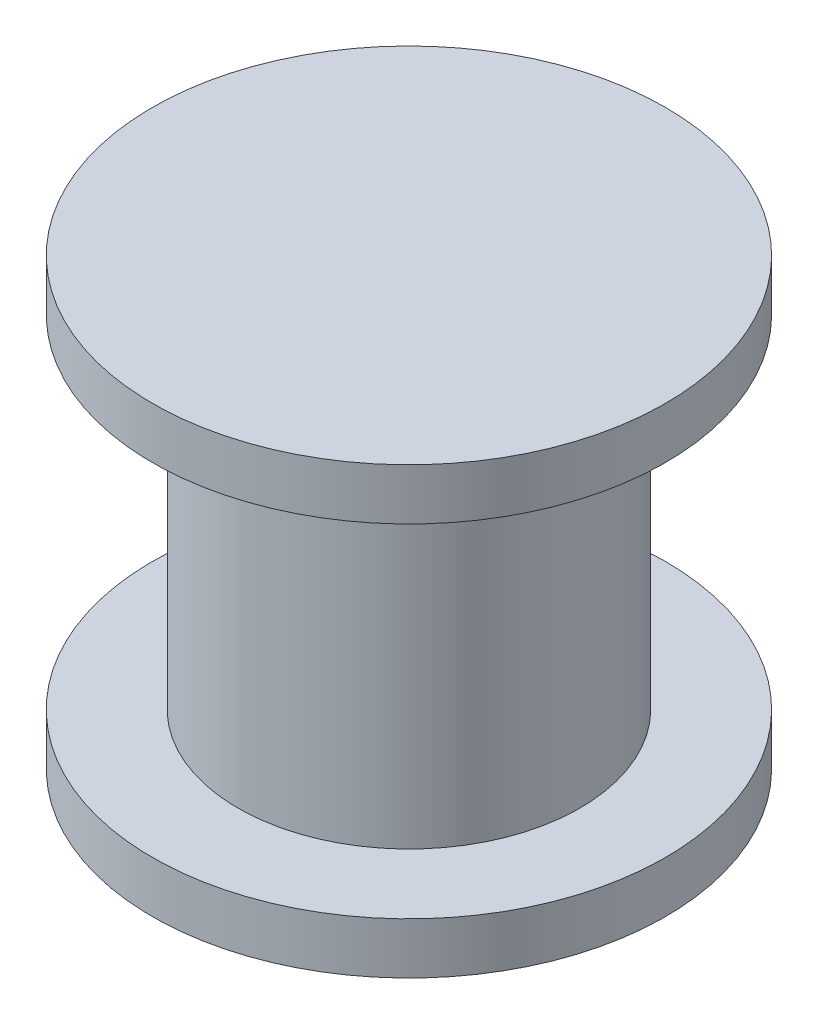
ISO-10303-21;
HEADER;
FILE_DESCRIPTION(('STEP AP214'),'2;1');
FILE_NAME('part.step','',(''),(''),'','','');
FILE_SCHEMA(('AUTOMOTIVE_DESIGN { 1 0 10303 214 1 1 1 1 }'));
ENDSEC;
DATA;
#1=APPLICATION_CONTEXT('core data for automotive mechanical design processes');
#2=APPLICATION_PROTOCOL_DEFINITION('international standard','automotive_design',2000,#1);
#3=PRODUCT_CONTEXT('',#1,'mechanical');
#4=PRODUCT('Part','Part','',(#3));
#5=PRODUCT_RELATED_PRODUCT_CATEGORY('part','',(#4));
#6=PRODUCT_DEFINITION_FORMATION('','',#4);
#7=PRODUCT_DEFINITION_CONTEXT('part definition',#1,'design');
#8=PRODUCT_DEFINITION('design','',#6,#7);
#9=PRODUCT_DEFINITION_SHAPE('','',#8);
#10=(LENGTH_UNIT() NAMED_UNIT(*) SI_UNIT(.MILLI.,.METRE.));
#11=(NAMED_UNIT(*) PLANE_ANGLE_UNIT() SI_UNIT($,.RADIAN.));
#12=(NAMED_UNIT(*) SI_UNIT($,.STERADIAN.) SOLID_ANGLE_UNIT());
#13=UNCERTAINTY_MEASURE_WITH_UNIT(LENGTH_MEASURE(1.E-05),#10,'distance_accuracy_value','');
#14=(GEOMETRIC_REPRESENTATION_CONTEXT(3) GLOBAL_UNCERTAINTY_ASSIGNED_CONTEXT((#13)) GLOBAL_UNIT_ASSIGNED_CONTEXT((#10,
#11,#12)) REPRESENTATION_CONTEXT('',''));
#15=CARTESIAN_POINT('',(0.,0.,0.));
#16=DIRECTION('',(0.,0.,1.));
#17=DIRECTION('',(1.,0.,0.));
#18=AXIS2_PLACEMENT_3D('',#15,#16,#17);
#19=CARTESIAN_POINT('',(0.,0.,0.));
#20=DIRECTION('',(0.,-1.,0.));
#21=DIRECTION('',(0.,0.,-1.));
#22=AXIS2_PLACEMENT_3D('',#19,#20,#21);
#23=CYLINDRICAL_SURFACE('',#22,15.);
#24=CARTESIAN_POINT('',(0.,3.,0.));
#25=DIRECTION('',(0.,-1.,0.));
#26=DIRECTION('',(0.,0.,-1.));
#27=AXIS2_PLACEMENT_3D('',#24,#25,#26);
#28=CIRCLE('',#27,15.);
#29=CARTESIAN_POINT('',(0.,3.,-15.));
#30=VERTEX_POINT('',#29);
#31=EDGE_CURVE('E55',#30,#30,#28,.T.);
#32=ORIENTED_EDGE('',*,*,#31,.T.);
#33=EDGE_LOOP('',(#32));
#34=FACE_BOUND('',#33,.T.);
#35=CARTESIAN_POINT('',(0.,0.,0.));
#36=DIRECTION('',(0.,-1.,0.));
#37=DIRECTION('',(0.,0.,-1.));
#38=AXIS2_PLACEMENT_3D('',#35,#36,#37);
#39=CIRCLE('',#38,15.);
#40=CARTESIAN_POINT('',(0.,0.,-15.));
#41=VERTEX_POINT('',#40);
#42=EDGE_CURVE('E10',#41,#41,#39,.T.);
#43=ORIENTED_EDGE('',*,*,#42,.F.);
#44=EDGE_LOOP('',(#43));
#45=FACE_BOUND('',#44,.T.);
#46=ADVANCED_FACE('F33',(#34,#45),#23,.T.);
#47=CARTESIAN_POINT('',(0.,0.,0.));
#48=DIRECTION('',(0.,-1.,0.));
#49=DIRECTION('',(0.,0.,-1.));
#50=AXIS2_PLACEMENT_3D('',#47,#48,#49);
#51=PLANE('',#50);
#52=ORIENTED_EDGE('',*,*,#42,.T.);
#53=EDGE_LOOP('',(#52));
#54=FACE_BOUND('',#53,.T.);
#55=ADVANCED_FACE('F79',(#54),#51,.T.);
#56=CARTESIAN_POINT('',(0.,26.,0.));
#57=DIRECTION('',(0.,-1.,0.));
#58=DIRECTION('',(0.,0.,-1.));
#59=AXIS2_PLACEMENT_3D('',#56,#57,#58);
#60=PLANE('',#59);
#61=CARTESIAN_POINT('',(0.,26.,0.));
#62=DIRECTION('',(0.,-1.,0.));
#63=DIRECTION('',(0.,0.,-1.));
#64=AXIS2_PLACEMENT_3D('',#61,#62,#63);
#65=CIRCLE('',#64,15.);
#66=CARTESIAN_POINT('',(0.,26.,-15.));
#67=VERTEX_POINT('',#66);
#68=EDGE_CURVE('E39',#67,#67,#65,.T.);
#69=ORIENTED_EDGE('',*,*,#68,.F.);
#70=EDGE_LOOP('',(#69));
#71=FACE_BOUND('',#70,.T.);
#72=ADVANCED_FACE('F83',(#71),#60,.F.);
#73=CARTESIAN_POINT('',(0.,0.,0.));
#74=DIRECTION('',(0.,-1.,0.));
#75=DIRECTION('',(0.,0.,-1.));
#76=AXIS2_PLACEMENT_3D('',#73,#74,#75);
#77=CYLINDRICAL_SURFACE('',#76,15.);
#78=ORIENTED_EDGE('',*,*,#68,.T.);
#79=EDGE_LOOP('',(#78));
#80=FACE_BOUND('',#79,.T.);
#81=CARTESIAN_POINT('',(0.,23.,0.));
#82=DIRECTION('',(0.,-1.,0.));
#83=DIRECTION('',(0.,0.,-1.));
#84=AXIS2_PLACEMENT_3D('',#81,#82,#83);
#85=CIRCLE('',#84,15.);
#86=CARTESIAN_POINT('',(0.,23.,-15.));
#87=VERTEX_POINT('',#86);
#88=EDGE_CURVE('E43',#87,#87,#85,.T.);
#89=ORIENTED_EDGE('',*,*,#88,.F.);
#90=EDGE_LOOP('',(#89));
#91=FACE_BOUND('',#90,.T.);
#92=ADVANCED_FACE('F75',(#80,#91),#77,.T.);
#93=CARTESIAN_POINT('',(0.,23.,0.));
#94=DIRECTION('',(0.,-1.,0.));
#95=DIRECTION('',(0.,0.,-1.));
#96=AXIS2_PLACEMENT_3D('',#93,#94,#95);
#97=PLANE('',#96);
#98=ORIENTED_EDGE('',*,*,#88,.T.);
#99=EDGE_LOOP('',(#98));
#100=FACE_BOUND('',#99,.T.);
#101=CARTESIAN_POINT('',(0.,23.,0.));
#102=DIRECTION('',(0.,-1.,0.));
#103=DIRECTION('',(0.,0.,-1.));
#104=AXIS2_PLACEMENT_3D('',#101,#102,#103);
#105=CIRCLE('',#104,10.);
#106=CARTESIAN_POINT('',(0.,23.,-10.));
#107=VERTEX_POINT('',#106);
#108=EDGE_CURVE('E47',#107,#107,#105,.T.);
#109=ORIENTED_EDGE('',*,*,#108,.F.);
#110=EDGE_LOOP('',(#109));
#111=FACE_BOUND('',#110,.T.);
#112=ADVANCED_FACE('F69',(#100,#111),#97,.T.);
#113=CARTESIAN_POINT('',(0.,0.,0.));
#114=DIRECTION('',(0.,-1.,0.));
#115=DIRECTION('',(0.,0.,-1.));
#116=AXIS2_PLACEMENT_3D('',#113,#114,#115);
#117=CYLINDRICAL_SURFACE('',#116,10.);
#118=ORIENTED_EDGE('',*,*,#108,.T.);
#119=EDGE_LOOP('',(#118));
#120=FACE_BOUND('',#119,.T.);
#121=CARTESIAN_POINT('',(0.,3.,0.));
#122=DIRECTION('',(0.,-1.,0.));
#123=DIRECTION('',(0.,0.,-1.));
#124=AXIS2_PLACEMENT_3D('',#121,#122,#123);
#125=CIRCLE('',#124,10.);
#126=CARTESIAN_POINT('',(0.,3.,-10.));
#127=VERTEX_POINT('',#126);
#128=EDGE_CURVE('E52',#127,#127,#125,.T.);
#129=ORIENTED_EDGE('',*,*,#128,.F.);
#130=EDGE_LOOP('',(#129));
#131=FACE_BOUND('',#130,.T.);
#132=ADVANCED_FACE('F64',(#120,#131),#117,.T.);
#133=CARTESIAN_POINT('',(0.,3.,0.));
#134=DIRECTION('',(0.,-1.,0.));
#135=DIRECTION('',(0.,0.,-1.));
#136=AXIS2_PLACEMENT_3D('',#133,#134,#135);
#137=PLANE('',#136);
#138=ORIENTED_EDGE('',*,*,#31,.F.);
#139=EDGE_LOOP('',(#138));
#140=FACE_BOUND('',#139,.T.);
#141=ORIENTED_EDGE('',*,*,#128,.T.);
#142=EDGE_LOOP('',(#141));
#143=FACE_BOUND('',#142,.T.);
#144=ADVANCED_FACE('F61',(#140,#143),#137,.F.);
#145=CLOSED_SHELL('',(#46,#55,#72,#92,#112,#132,#144));
#146=MANIFOLD_SOLID_BREP('B2',#145);
#147=ADVANCED_BREP_SHAPE_REPRESENTATION('',(#18,#146),#14);
#148=SHAPE_DEFINITION_REPRESENTATION(#9,#147);
ENDSEC;
END-ISO-10303-21;
